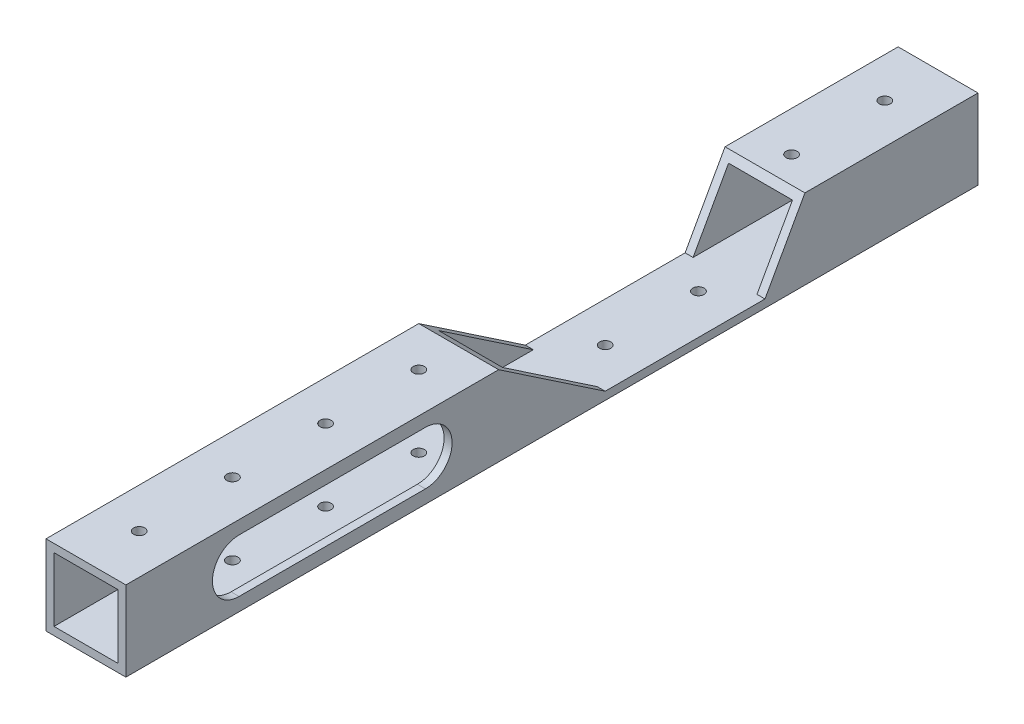
ISO-10303-21;
HEADER;
FILE_DESCRIPTION(('STEP AP214'),'2;1');
FILE_NAME('part.step','',(''),(''),'','','');
FILE_SCHEMA(('AUTOMOTIVE_DESIGN { 1 0 10303 214 1 1 1 1 }'));
ENDSEC;
DATA;
#1=APPLICATION_CONTEXT('core data for automotive mechanical design processes');
#2=APPLICATION_PROTOCOL_DEFINITION('international standard','automotive_design',2000,#1);
#3=PRODUCT_CONTEXT('',#1,'mechanical');
#4=PRODUCT('Part','Part','',(#3));
#5=PRODUCT_RELATED_PRODUCT_CATEGORY('part','',(#4));
#6=PRODUCT_DEFINITION_FORMATION('','',#4);
#7=PRODUCT_DEFINITION_CONTEXT('part definition',#1,'design');
#8=PRODUCT_DEFINITION('design','',#6,#7);
#9=PRODUCT_DEFINITION_SHAPE('','',#8);
#10=(LENGTH_UNIT() NAMED_UNIT(*) SI_UNIT(.MILLI.,.METRE.));
#11=(NAMED_UNIT(*) PLANE_ANGLE_UNIT() SI_UNIT($,.RADIAN.));
#12=(NAMED_UNIT(*) SI_UNIT($,.STERADIAN.) SOLID_ANGLE_UNIT());
#13=UNCERTAINTY_MEASURE_WITH_UNIT(LENGTH_MEASURE(1.E-05),#10,'distance_accuracy_value','');
#14=(GEOMETRIC_REPRESENTATION_CONTEXT(3) GLOBAL_UNCERTAINTY_ASSIGNED_CONTEXT((#13)) GLOBAL_UNIT_ASSIGNED_CONTEXT((#10,
#11,#12)) REPRESENTATION_CONTEXT('',''));
#15=CARTESIAN_POINT('',(0.,0.,0.));
#16=DIRECTION('',(0.,0.,1.));
#17=DIRECTION('',(1.,0.,0.));
#18=AXIS2_PLACEMENT_3D('',#15,#16,#17);
#19=CARTESIAN_POINT('',(0.,0.,320.));
#20=DIRECTION('',(1.,0.,0.));
#21=DIRECTION('',(0.,0.,-1.));
#22=AXIS2_PLACEMENT_3D('',#19,#20,#21);
#23=PLANE('',#22);
#24=DIRECTION('',(0.,0.,1.));
#25=VECTOR('',#24,1.);
#26=CARTESIAN_POINT('',(0.,25.,277.5));
#27=LINE('',#26,#25);
#28=CARTESIAN_POINT('',(0.,25.,207.5));
#29=VERTEX_POINT('',#28);
#30=CARTESIAN_POINT('',(0.,25.,277.5));
#31=VERTEX_POINT('',#30);
#32=EDGE_CURVE('E356',#29,#31,#27,.T.);
#33=ORIENTED_EDGE('',*,*,#32,.T.);
#34=CARTESIAN_POINT('',(0.,15.,277.5));
#35=DIRECTION('',(1.,0.,0.));
#36=DIRECTION('',(0.,0.,-1.));
#37=AXIS2_PLACEMENT_3D('',#34,#35,#36);
#38=CIRCLE('',#37,10.);
#39=CARTESIAN_POINT('',(0.,5.00000000000001,277.5));
#40=VERTEX_POINT('',#39);
#41=EDGE_CURVE('E346',#31,#40,#38,.T.);
#42=ORIENTED_EDGE('',*,*,#41,.T.);
#43=DIRECTION('',(0.,0.,-1.));
#44=VECTOR('',#43,1.);
#45=CARTESIAN_POINT('',(0.,5.00000000000001,277.5));
#46=LINE('',#45,#44);
#47=CARTESIAN_POINT('',(0.,5.00000000000001,207.5));
#48=VERTEX_POINT('',#47);
#49=EDGE_CURVE('E349',#40,#48,#46,.T.);
#50=ORIENTED_EDGE('',*,*,#49,.T.);
#51=CARTESIAN_POINT('',(0.,15.,207.5));
#52=DIRECTION('',(1.,0.,0.));
#53=DIRECTION('',(0.,0.,-1.));
#54=AXIS2_PLACEMENT_3D('',#51,#52,#53);
#55=CIRCLE('',#54,10.);
#56=EDGE_CURVE('E353',#48,#29,#55,.T.);
#57=ORIENTED_EDGE('',*,*,#56,.T.);
#58=EDGE_LOOP('',(#33,#42,#50,#57));
#59=FACE_BOUND('',#58,.T.);
#60=DIRECTION('',(0.,0.874157276121538,-0.485642931178632));
#61=VECTOR('',#60,1.);
#62=CARTESIAN_POINT('',(0.,34.6698113207547,62.4056603773585));
#63=LINE('',#62,#61);
#64=CARTESIAN_POINT('',(0.,3.00000000000001,80.));
#65=VERTEX_POINT('',#64);
#66=CARTESIAN_POINT('',(0.,30.,65.));
#67=VERTEX_POINT('',#66);
#68=EDGE_CURVE('E251',#65,#67,#63,.T.);
#69=ORIENTED_EDGE('',*,*,#68,.T.);
#70=DIRECTION('',(0.,0.,-1.));
#71=VECTOR('',#70,1.);
#72=CARTESIAN_POINT('',(0.,30.,320.));
#73=LINE('',#72,#71);
#74=CARTESIAN_POINT('',(0.,30.,0.));
#75=VERTEX_POINT('',#74);
#76=EDGE_CURVE('E439',#67,#75,#73,.T.);
#77=ORIENTED_EDGE('',*,*,#76,.T.);
#78=DIRECTION('',(0.,-1.,0.));
#79=VECTOR('',#78,1.);
#80=CARTESIAN_POINT('',(0.,0.,0.));
#81=LINE('',#80,#79);
#82=CARTESIAN_POINT('',(0.,0.,0.));
#83=VERTEX_POINT('',#82);
#84=EDGE_CURVE('E428',#75,#83,#81,.T.);
#85=ORIENTED_EDGE('',*,*,#84,.T.);
#86=DIRECTION('',(0.,0.,-1.));
#87=VECTOR('',#86,1.);
#88=CARTESIAN_POINT('',(0.,0.,320.));
#89=LINE('',#88,#87);
#90=CARTESIAN_POINT('',(0.,0.,320.));
#91=VERTEX_POINT('',#90);
#92=EDGE_CURVE('E457',#91,#83,#89,.T.);
#93=ORIENTED_EDGE('',*,*,#92,.F.);
#94=DIRECTION('',(0.,-1.,0.));
#95=VECTOR('',#94,1.);
#96=CARTESIAN_POINT('',(0.,0.,320.));
#97=LINE('',#96,#95);
#98=CARTESIAN_POINT('',(0.,30.,320.));
#99=VERTEX_POINT('',#98);
#100=EDGE_CURVE('E429',#99,#91,#97,.T.);
#101=ORIENTED_EDGE('',*,*,#100,.F.);
#102=CARTESIAN_POINT('',(0.,30.,180.));
#103=VERTEX_POINT('',#102);
#104=EDGE_CURVE('E448',#99,#103,#73,.T.);
#105=ORIENTED_EDGE('',*,*,#104,.T.);
#106=DIRECTION('',(0.,0.559472855001063,0.828848674075648));
#107=VECTOR('',#106,1.);
#108=CARTESIAN_POINT('',(0.,-62.8595963933019,42.4302275654788));
#109=LINE('',#108,#107);
#110=CARTESIAN_POINT('',(0.,3.,140.));
#111=VERTEX_POINT('',#110);
#112=EDGE_CURVE('E73',#111,#103,#109,.T.);
#113=ORIENTED_EDGE('',*,*,#112,.F.);
#114=DIRECTION('',(0.,0.,-1.));
#115=VECTOR('',#114,1.);
#116=CARTESIAN_POINT('',(0.,3.00000000000001,0.));
#117=LINE('',#116,#115);
#118=EDGE_CURVE('E248',#111,#65,#117,.T.);
#119=ORIENTED_EDGE('',*,*,#118,.T.);
#120=EDGE_LOOP('',(#69,#77,#85,#93,#101,#105,#113,#119));
#121=FACE_BOUND('',#120,.T.);
#122=ADVANCED_FACE('F59',(#59,#121),#23,.F.);
#123=CARTESIAN_POINT('',(30.,0.,320.));
#124=DIRECTION('',(-1.,0.,0.));
#125=DIRECTION('',(0.,0.,1.));
#126=AXIS2_PLACEMENT_3D('',#123,#124,#125);
#127=PLANE('',#126);
#128=DIRECTION('',(0.,0.,-1.));
#129=VECTOR('',#128,1.);
#130=CARTESIAN_POINT('',(30.,5.00000000000001,277.5));
#131=LINE('',#130,#129);
#132=CARTESIAN_POINT('',(30.,5.00000000000001,277.5));
#133=VERTEX_POINT('',#132);
#134=CARTESIAN_POINT('',(30.,4.99999999999999,207.5));
#135=VERTEX_POINT('',#134);
#136=EDGE_CURVE('E361',#133,#135,#131,.T.);
#137=ORIENTED_EDGE('',*,*,#136,.F.);
#138=CARTESIAN_POINT('',(30.,15.,277.5));
#139=DIRECTION('',(1.,0.,0.));
#140=DIRECTION('',(0.,0.,-1.));
#141=AXIS2_PLACEMENT_3D('',#138,#139,#140);
#142=CIRCLE('',#141,10.);
#143=CARTESIAN_POINT('',(30.,25.,277.5));
#144=VERTEX_POINT('',#143);
#145=EDGE_CURVE('E345',#144,#133,#142,.T.);
#146=ORIENTED_EDGE('',*,*,#145,.F.);
#147=DIRECTION('',(0.,0.,1.));
#148=VECTOR('',#147,1.);
#149=CARTESIAN_POINT('',(30.,25.,277.5));
#150=LINE('',#149,#148);
#151=CARTESIAN_POINT('',(30.,25.,207.5));
#152=VERTEX_POINT('',#151);
#153=EDGE_CURVE('E350',#152,#144,#150,.T.);
#154=ORIENTED_EDGE('',*,*,#153,.F.);
#155=CARTESIAN_POINT('',(30.,15.,207.5));
#156=DIRECTION('',(1.,0.,0.));
#157=DIRECTION('',(0.,0.,-1.));
#158=AXIS2_PLACEMENT_3D('',#155,#156,#157);
#159=CIRCLE('',#158,10.);
#160=EDGE_CURVE('E364',#135,#152,#159,.T.);
#161=ORIENTED_EDGE('',*,*,#160,.F.);
#162=EDGE_LOOP('',(#137,#146,#154,#161));
#163=FACE_BOUND('',#162,.T.);
#164=DIRECTION('',(0.,0.874157276121538,-0.485642931178632));
#165=VECTOR('',#164,1.);
#166=CARTESIAN_POINT('',(30.,34.6698113207547,62.4056603773585));
#167=LINE('',#166,#165);
#168=CARTESIAN_POINT('',(30.,3.00000000000001,80.));
#169=VERTEX_POINT('',#168);
#170=CARTESIAN_POINT('',(30.,30.,65.));
#171=VERTEX_POINT('',#170);
#172=EDGE_CURVE('E230',#169,#171,#167,.T.);
#173=ORIENTED_EDGE('',*,*,#172,.F.);
#174=DIRECTION('',(0.,0.,-1.));
#175=VECTOR('',#174,1.);
#176=CARTESIAN_POINT('',(30.,3.00000000000001,0.));
#177=LINE('',#176,#175);
#178=CARTESIAN_POINT('',(30.,3.,140.));
#179=VERTEX_POINT('',#178);
#180=EDGE_CURVE('E218',#179,#169,#177,.T.);
#181=ORIENTED_EDGE('',*,*,#180,.F.);
#182=DIRECTION('',(0.,0.559472855001063,0.828848674075648));
#183=VECTOR('',#182,1.);
#184=CARTESIAN_POINT('',(30.,-62.8595963933019,42.4302275654788));
#185=LINE('',#184,#183);
#186=CARTESIAN_POINT('',(30.,30.,180.));
#187=VERTEX_POINT('',#186);
#188=EDGE_CURVE('E243',#179,#187,#185,.T.);
#189=ORIENTED_EDGE('',*,*,#188,.T.);
#190=DIRECTION('',(0.,0.,-1.));
#191=VECTOR('',#190,1.);
#192=CARTESIAN_POINT('',(30.,30.,320.));
#193=LINE('',#192,#191);
#194=CARTESIAN_POINT('',(30.,30.,320.));
#195=VERTEX_POINT('',#194);
#196=EDGE_CURVE('E451',#195,#187,#193,.T.);
#197=ORIENTED_EDGE('',*,*,#196,.F.);
#198=DIRECTION('',(0.,1.,0.));
#199=VECTOR('',#198,1.);
#200=CARTESIAN_POINT('',(30.,0.,320.));
#201=LINE('',#200,#199);
#202=CARTESIAN_POINT('',(30.,0.,320.));
#203=VERTEX_POINT('',#202);
#204=EDGE_CURVE('E435',#203,#195,#201,.T.);
#205=ORIENTED_EDGE('',*,*,#204,.F.);
#206=DIRECTION('',(0.,0.,-1.));
#207=VECTOR('',#206,1.);
#208=CARTESIAN_POINT('',(30.,0.,320.));
#209=LINE('',#208,#207);
#210=CARTESIAN_POINT('',(30.,0.,0.));
#211=VERTEX_POINT('',#210);
#212=EDGE_CURVE('E454',#203,#211,#209,.T.);
#213=ORIENTED_EDGE('',*,*,#212,.T.);
#214=DIRECTION('',(0.,1.,0.));
#215=VECTOR('',#214,1.);
#216=CARTESIAN_POINT('',(30.,0.,0.));
#217=LINE('',#216,#215);
#218=CARTESIAN_POINT('',(30.,30.,0.));
#219=VERTEX_POINT('',#218);
#220=EDGE_CURVE('E444',#211,#219,#217,.T.);
#221=ORIENTED_EDGE('',*,*,#220,.T.);
#222=EDGE_CURVE('E242',#171,#219,#193,.T.);
#223=ORIENTED_EDGE('',*,*,#222,.F.);
#224=EDGE_LOOP('',(#173,#181,#189,#197,#205,#213,#221,#223));
#225=FACE_BOUND('',#224,.T.);
#226=ADVANCED_FACE('F240',(#163,#225),#127,.F.);
#227=CARTESIAN_POINT('',(0.,30.,320.));
#228=DIRECTION('',(0.,-1.,0.));
#229=DIRECTION('',(0.,0.,-1.));
#230=AXIS2_PLACEMENT_3D('',#227,#228,#229);
#231=PLANE('',#230);
#232=CARTESIAN_POINT('',(15.,30.,55.));
#233=DIRECTION('',(0.,1.,0.));
#234=DIRECTION('',(0.,0.,1.));
#235=AXIS2_PLACEMENT_3D('',#232,#233,#234);
#236=CIRCLE('',#235,2.1);
#237=CARTESIAN_POINT('',(15.,30.,57.1));
#238=VERTEX_POINT('',#237);
#239=EDGE_CURVE('E293',#238,#238,#236,.T.);
#240=ORIENTED_EDGE('',*,*,#239,.F.);
#241=EDGE_LOOP('',(#240));
#242=FACE_BOUND('',#241,.T.);
#243=CARTESIAN_POINT('',(15.,30.,20.));
#244=DIRECTION('',(0.,1.,0.));
#245=DIRECTION('',(0.,0.,1.));
#246=AXIS2_PLACEMENT_3D('',#243,#244,#245);
#247=CIRCLE('',#246,2.1);
#248=CARTESIAN_POINT('',(15.,30.,22.1));
#249=VERTEX_POINT('',#248);
#250=EDGE_CURVE('E335',#249,#249,#247,.T.);
#251=ORIENTED_EDGE('',*,*,#250,.F.);
#252=EDGE_LOOP('',(#251));
#253=FACE_BOUND('',#252,.T.);
#254=DIRECTION('',(-1.,0.,0.));
#255=VECTOR('',#254,1.);
#256=CARTESIAN_POINT('',(30.,30.,65.));
#257=LINE('',#256,#255);
#258=EDGE_CURVE('E258',#171,#67,#257,.T.);
#259=ORIENTED_EDGE('',*,*,#258,.F.);
#260=ORIENTED_EDGE('',*,*,#222,.T.);
#261=DIRECTION('',(-1.,0.,0.));
#262=VECTOR('',#261,1.);
#263=CARTESIAN_POINT('',(0.,30.,0.));
#264=LINE('',#263,#262);
#265=EDGE_CURVE('E433',#219,#75,#264,.T.);
#266=ORIENTED_EDGE('',*,*,#265,.T.);
#267=ORIENTED_EDGE('',*,*,#76,.F.);
#268=EDGE_LOOP('',(#259,#260,#266,#267));
#269=FACE_BOUND('',#268,.T.);
#270=ADVANCED_FACE('F522',(#242,#253,#269),#231,.F.);
#271=CARTESIAN_POINT('',(3.,0.,320.));
#272=DIRECTION('',(1.,0.,0.));
#273=DIRECTION('',(0.,0.,-1.));
#274=AXIS2_PLACEMENT_3D('',#271,#272,#273);
#275=PLANE('',#274);
#276=DIRECTION('',(0.,0.,-1.));
#277=VECTOR('',#276,1.);
#278=CARTESIAN_POINT('',(3.,27.,320.));
#279=LINE('',#278,#277);
#280=CARTESIAN_POINT('',(3.,27.,66.6666666666667));
#281=VERTEX_POINT('',#280);
#282=CARTESIAN_POINT('',(3.,27.,0.));
#283=VERTEX_POINT('',#282);
#284=EDGE_CURVE('E403',#281,#283,#279,.T.);
#285=ORIENTED_EDGE('',*,*,#284,.F.);
#286=DIRECTION('',(0.,-0.874157276121538,0.485642931178632));
#287=VECTOR('',#286,1.);
#288=CARTESIAN_POINT('',(3.,-101.179245283019,137.877358490566));
#289=LINE('',#288,#287);
#290=CARTESIAN_POINT('',(3.,3.00000000000001,80.));
#291=VERTEX_POINT('',#290);
#292=EDGE_CURVE('E264',#281,#291,#289,.T.);
#293=ORIENTED_EDGE('',*,*,#292,.T.);
#294=DIRECTION('',(0.,0.,-1.));
#295=VECTOR('',#294,1.);
#296=CARTESIAN_POINT('',(3.,3.,320.));
#297=LINE('',#296,#295);
#298=CARTESIAN_POINT('',(3.,3.,0.));
#299=VERTEX_POINT('',#298);
#300=EDGE_CURVE('E424',#291,#299,#297,.T.);
#301=ORIENTED_EDGE('',*,*,#300,.T.);
#302=DIRECTION('',(0.,-1.,0.));
#303=VECTOR('',#302,1.);
#304=CARTESIAN_POINT('',(3.,0.,0.));
#305=LINE('',#304,#303);
#306=EDGE_CURVE('E392',#283,#299,#305,.T.);
#307=ORIENTED_EDGE('',*,*,#306,.F.);
#308=EDGE_LOOP('',(#285,#293,#301,#307));
#309=FACE_BOUND('',#308,.T.);
#310=ADVANCED_FACE('F525',(#309),#275,.T.);
#311=CARTESIAN_POINT('',(27.,0.,320.));
#312=DIRECTION('',(-1.,0.,0.));
#313=DIRECTION('',(0.,0.,1.));
#314=AXIS2_PLACEMENT_3D('',#311,#312,#313);
#315=PLANE('',#314);
#316=DIRECTION('',(0.,0.,-1.));
#317=VECTOR('',#316,1.);
#318=CARTESIAN_POINT('',(27.,3.,320.));
#319=LINE('',#318,#317);
#320=CARTESIAN_POINT('',(27.,3.00000000000001,80.));
#321=VERTEX_POINT('',#320);
#322=CARTESIAN_POINT('',(27.,3.,0.));
#323=VERTEX_POINT('',#322);
#324=EDGE_CURVE('E421',#321,#323,#319,.T.);
#325=ORIENTED_EDGE('',*,*,#324,.F.);
#326=DIRECTION('',(0.,0.874157276121538,-0.485642931178632));
#327=VECTOR('',#326,1.);
#328=CARTESIAN_POINT('',(27.,-101.179245283019,137.877358490566));
#329=LINE('',#328,#327);
#330=CARTESIAN_POINT('',(27.,27.,66.6666666666667));
#331=VERTEX_POINT('',#330);
#332=EDGE_CURVE('E236',#321,#331,#329,.T.);
#333=ORIENTED_EDGE('',*,*,#332,.T.);
#334=DIRECTION('',(0.,0.,-1.));
#335=VECTOR('',#334,1.);
#336=CARTESIAN_POINT('',(27.,27.,320.));
#337=LINE('',#336,#335);
#338=CARTESIAN_POINT('',(27.,27.,0.));
#339=VERTEX_POINT('',#338);
#340=EDGE_CURVE('E417',#331,#339,#337,.T.);
#341=ORIENTED_EDGE('',*,*,#340,.T.);
#342=DIRECTION('',(0.,1.,0.));
#343=VECTOR('',#342,1.);
#344=CARTESIAN_POINT('',(27.,0.,0.));
#345=LINE('',#344,#343);
#346=EDGE_CURVE('E409',#323,#339,#345,.T.);
#347=ORIENTED_EDGE('',*,*,#346,.F.);
#348=EDGE_LOOP('',(#325,#333,#341,#347));
#349=FACE_BOUND('',#348,.T.);
#350=ADVANCED_FACE('F534',(#349),#315,.T.);
#351=CARTESIAN_POINT('',(0.,27.,320.));
#352=DIRECTION('',(0.,-1.,0.));
#353=DIRECTION('',(0.,0.,-1.));
#354=AXIS2_PLACEMENT_3D('',#351,#352,#353);
#355=PLANE('',#354);
#356=CARTESIAN_POINT('',(15.,27.,55.));
#357=DIRECTION('',(0.,-1.,0.));
#358=DIRECTION('',(0.,0.,-1.));
#359=AXIS2_PLACEMENT_3D('',#356,#357,#358);
#360=CIRCLE('',#359,2.1);
#361=CARTESIAN_POINT('',(15.,27.,52.9));
#362=VERTEX_POINT('',#361);
#363=EDGE_CURVE('E292',#362,#362,#360,.T.);
#364=ORIENTED_EDGE('',*,*,#363,.F.);
#365=EDGE_LOOP('',(#364));
#366=FACE_BOUND('',#365,.T.);
#367=CARTESIAN_POINT('',(15.,27.,20.));
#368=DIRECTION('',(0.,-1.,0.));
#369=DIRECTION('',(0.,0.,-1.));
#370=AXIS2_PLACEMENT_3D('',#367,#368,#369);
#371=CIRCLE('',#370,2.1);
#372=CARTESIAN_POINT('',(15.,27.,17.9));
#373=VERTEX_POINT('',#372);
#374=EDGE_CURVE('E339',#373,#373,#371,.T.);
#375=ORIENTED_EDGE('',*,*,#374,.F.);
#376=EDGE_LOOP('',(#375));
#377=FACE_BOUND('',#376,.T.);
#378=ORIENTED_EDGE('',*,*,#340,.F.);
#379=DIRECTION('',(-1.,0.,0.));
#380=VECTOR('',#379,1.);
#381=CARTESIAN_POINT('',(0.,27.,66.6666666666667));
#382=LINE('',#381,#380);
#383=EDGE_CURVE('E12',#331,#281,#382,.T.);
#384=ORIENTED_EDGE('',*,*,#383,.T.);
#385=ORIENTED_EDGE('',*,*,#284,.T.);
#386=DIRECTION('',(-1.,0.,0.));
#387=VECTOR('',#386,1.);
#388=CARTESIAN_POINT('',(0.,27.,0.));
#389=LINE('',#388,#387);
#390=EDGE_CURVE('E396',#339,#283,#389,.T.);
#391=ORIENTED_EDGE('',*,*,#390,.F.);
#392=EDGE_LOOP('',(#378,#384,#385,#391));
#393=FACE_BOUND('',#392,.T.);
#394=ADVANCED_FACE('F532',(#366,#377,#393),#355,.T.);
#395=CARTESIAN_POINT('',(0.,0.,320.));
#396=DIRECTION('',(0.,0.,1.));
#397=DIRECTION('',(1.,0.,0.));
#398=AXIS2_PLACEMENT_3D('',#395,#396,#397);
#399=PLANE('',#398);
#400=ORIENTED_EDGE('',*,*,#100,.T.);
#401=DIRECTION('',(1.,0.,0.));
#402=VECTOR('',#401,1.);
#403=CARTESIAN_POINT('',(0.,0.,320.));
#404=LINE('',#403,#402);
#405=EDGE_CURVE('E432',#91,#203,#404,.T.);
#406=ORIENTED_EDGE('',*,*,#405,.T.);
#407=ORIENTED_EDGE('',*,*,#204,.T.);
#408=DIRECTION('',(-1.,0.,0.));
#409=VECTOR('',#408,1.);
#410=CARTESIAN_POINT('',(0.,30.,320.));
#411=LINE('',#410,#409);
#412=EDGE_CURVE('E437',#195,#99,#411,.T.);
#413=ORIENTED_EDGE('',*,*,#412,.T.);
#414=EDGE_LOOP('',(#400,#406,#407,#413));
#415=FACE_BOUND('',#414,.T.);
#416=DIRECTION('',(1.,0.,0.));
#417=VECTOR('',#416,1.);
#418=CARTESIAN_POINT('',(0.,3.,320.));
#419=LINE('',#418,#417);
#420=CARTESIAN_POINT('',(3.,3.,320.));
#421=VERTEX_POINT('',#420);
#422=CARTESIAN_POINT('',(27.,3.,320.));
#423=VERTEX_POINT('',#422);
#424=EDGE_CURVE('E395',#421,#423,#419,.T.);
#425=ORIENTED_EDGE('',*,*,#424,.F.);
#426=DIRECTION('',(0.,-1.,0.));
#427=VECTOR('',#426,1.);
#428=CARTESIAN_POINT('',(3.,0.,320.));
#429=LINE('',#428,#427);
#430=CARTESIAN_POINT('',(3.,27.,320.));
#431=VERTEX_POINT('',#430);
#432=EDGE_CURVE('E393',#431,#421,#429,.T.);
#433=ORIENTED_EDGE('',*,*,#432,.F.);
#434=DIRECTION('',(-1.,0.,0.));
#435=VECTOR('',#434,1.);
#436=CARTESIAN_POINT('',(0.,27.,320.));
#437=LINE('',#436,#435);
#438=CARTESIAN_POINT('',(27.,27.,320.));
#439=VERTEX_POINT('',#438);
#440=EDGE_CURVE('E401',#439,#431,#437,.T.);
#441=ORIENTED_EDGE('',*,*,#440,.F.);
#442=DIRECTION('',(0.,1.,0.));
#443=VECTOR('',#442,1.);
#444=CARTESIAN_POINT('',(27.,0.,320.));
#445=LINE('',#444,#443);
#446=EDGE_CURVE('E398',#423,#439,#445,.T.);
#447=ORIENTED_EDGE('',*,*,#446,.F.);
#448=EDGE_LOOP('',(#425,#433,#441,#447));
#449=FACE_BOUND('',#448,.T.);
#450=ADVANCED_FACE('F496',(#415,#449),#399,.T.);
#451=CARTESIAN_POINT('',(0.,0.,0.));
#452=DIRECTION('',(0.,0.,1.));
#453=DIRECTION('',(1.,0.,0.));
#454=AXIS2_PLACEMENT_3D('',#451,#452,#453);
#455=PLANE('',#454);
#456=ORIENTED_EDGE('',*,*,#84,.F.);
#457=ORIENTED_EDGE('',*,*,#265,.F.);
#458=ORIENTED_EDGE('',*,*,#220,.F.);
#459=DIRECTION('',(1.,0.,0.));
#460=VECTOR('',#459,1.);
#461=CARTESIAN_POINT('',(0.,0.,0.));
#462=LINE('',#461,#460);
#463=EDGE_CURVE('E442',#83,#211,#462,.T.);
#464=ORIENTED_EDGE('',*,*,#463,.F.);
#465=EDGE_LOOP('',(#456,#457,#458,#464));
#466=FACE_BOUND('',#465,.T.);
#467=ORIENTED_EDGE('',*,*,#306,.T.);
#468=DIRECTION('',(1.,0.,0.));
#469=VECTOR('',#468,1.);
#470=CARTESIAN_POINT('',(0.,3.,0.));
#471=LINE('',#470,#469);
#472=EDGE_CURVE('E406',#299,#323,#471,.T.);
#473=ORIENTED_EDGE('',*,*,#472,.T.);
#474=ORIENTED_EDGE('',*,*,#346,.T.);
#475=ORIENTED_EDGE('',*,*,#390,.T.);
#476=EDGE_LOOP('',(#467,#473,#474,#475));
#477=FACE_BOUND('',#476,.T.);
#478=ADVANCED_FACE('F517',(#466,#477),#455,.F.);
#479=CARTESIAN_POINT('',(0.,0.,320.));
#480=DIRECTION('',(0.,1.,0.));
#481=DIRECTION('',(0.,0.,1.));
#482=AXIS2_PLACEMENT_3D('',#479,#480,#481);
#483=PLANE('',#482);
#484=CARTESIAN_POINT('',(15.,0.,160.));
#485=DIRECTION('',(0.,1.,0.));
#486=DIRECTION('',(0.,0.,1.));
#487=AXIS2_PLACEMENT_3D('',#484,#485,#486);
#488=CIRCLE('',#487,2.09999999999999);
#489=CARTESIAN_POINT('',(15.,0.,162.1));
#490=VERTEX_POINT('',#489);
#491=EDGE_CURVE('E267',#490,#490,#488,.T.);
#492=ORIENTED_EDGE('',*,*,#491,.T.);
#493=EDGE_LOOP('',(#492));
#494=FACE_BOUND('',#493,.T.);
#495=CARTESIAN_POINT('',(15.,0.,195.));
#496=DIRECTION('',(0.,1.,0.));
#497=DIRECTION('',(0.,0.,-1.));
#498=AXIS2_PLACEMENT_3D('',#495,#496,#497);
#499=CIRCLE('',#498,2.09999999999999);
#500=CARTESIAN_POINT('',(15.,0.,192.9));
#501=VERTEX_POINT('',#500);
#502=EDGE_CURVE('E281',#501,#501,#499,.T.);
#503=ORIENTED_EDGE('',*,*,#502,.T.);
#504=EDGE_LOOP('',(#503));
#505=FACE_BOUND('',#504,.T.);
#506=CARTESIAN_POINT('',(15.,0.,230.));
#507=DIRECTION('',(0.,1.,0.));
#508=DIRECTION('',(0.,0.,-1.));
#509=AXIS2_PLACEMENT_3D('',#506,#507,#508);
#510=CIRCLE('',#509,2.1);
#511=CARTESIAN_POINT('',(15.,0.,227.9));
#512=VERTEX_POINT('',#511);
#513=EDGE_CURVE('E275',#512,#512,#510,.T.);
#514=ORIENTED_EDGE('',*,*,#513,.T.);
#515=EDGE_LOOP('',(#514));
#516=FACE_BOUND('',#515,.T.);
#517=CARTESIAN_POINT('',(15.,0.,265.));
#518=DIRECTION('',(0.,1.,0.));
#519=DIRECTION('',(0.,0.,-1.));
#520=AXIS2_PLACEMENT_3D('',#517,#518,#519);
#521=CIRCLE('',#520,2.09999999999999);
#522=CARTESIAN_POINT('',(15.,0.,262.9));
#523=VERTEX_POINT('',#522);
#524=EDGE_CURVE('E268',#523,#523,#521,.T.);
#525=ORIENTED_EDGE('',*,*,#524,.T.);
#526=EDGE_LOOP('',(#525));
#527=FACE_BOUND('',#526,.T.);
#528=CARTESIAN_POINT('',(15.,0.,300.));
#529=DIRECTION('',(0.,1.,0.));
#530=DIRECTION('',(0.,0.,-1.));
#531=AXIS2_PLACEMENT_3D('',#528,#529,#530);
#532=CIRCLE('',#531,2.09999999999999);
#533=CARTESIAN_POINT('',(15.,0.,297.9));
#534=VERTEX_POINT('',#533);
#535=EDGE_CURVE('E302',#534,#534,#532,.T.);
#536=ORIENTED_EDGE('',*,*,#535,.T.);
#537=EDGE_LOOP('',(#536));
#538=FACE_BOUND('',#537,.T.);
#539=CARTESIAN_POINT('',(15.,0.,125.));
#540=DIRECTION('',(0.,1.,0.));
#541=DIRECTION('',(0.,0.,1.));
#542=AXIS2_PLACEMENT_3D('',#539,#540,#541);
#543=CIRCLE('',#542,2.1);
#544=CARTESIAN_POINT('',(15.,0.,127.1));
#545=VERTEX_POINT('',#544);
#546=EDGE_CURVE('E299',#545,#545,#543,.T.);
#547=ORIENTED_EDGE('',*,*,#546,.T.);
#548=EDGE_LOOP('',(#547));
#549=FACE_BOUND('',#548,.T.);
#550=CARTESIAN_POINT('',(15.,0.,90.));
#551=DIRECTION('',(0.,1.,0.));
#552=DIRECTION('',(0.,0.,1.));
#553=AXIS2_PLACEMENT_3D('',#550,#551,#552);
#554=CIRCLE('',#553,2.1);
#555=CARTESIAN_POINT('',(15.,0.,92.1));
#556=VERTEX_POINT('',#555);
#557=EDGE_CURVE('E296',#556,#556,#554,.T.);
#558=ORIENTED_EDGE('',*,*,#557,.T.);
#559=EDGE_LOOP('',(#558));
#560=FACE_BOUND('',#559,.T.);
#561=CARTESIAN_POINT('',(15.,0.,55.));
#562=DIRECTION('',(0.,1.,0.));
#563=DIRECTION('',(0.,0.,1.));
#564=AXIS2_PLACEMENT_3D('',#561,#562,#563);
#565=CIRCLE('',#564,2.1);
#566=CARTESIAN_POINT('',(15.,0.,57.1));
#567=VERTEX_POINT('',#566);
#568=EDGE_CURVE('E289',#567,#567,#565,.T.);
#569=ORIENTED_EDGE('',*,*,#568,.T.);
#570=EDGE_LOOP('',(#569));
#571=FACE_BOUND('',#570,.T.);
#572=CARTESIAN_POINT('',(15.,0.,20.));
#573=DIRECTION('',(0.,1.,0.));
#574=DIRECTION('',(0.,0.,1.));
#575=AXIS2_PLACEMENT_3D('',#572,#573,#574);
#576=CIRCLE('',#575,2.1);
#577=CARTESIAN_POINT('',(15.,0.,22.1));
#578=VERTEX_POINT('',#577);
#579=EDGE_CURVE('E336',#578,#578,#576,.T.);
#580=ORIENTED_EDGE('',*,*,#579,.T.);
#581=EDGE_LOOP('',(#580));
#582=FACE_BOUND('',#581,.T.);
#583=ORIENTED_EDGE('',*,*,#463,.T.);
#584=ORIENTED_EDGE('',*,*,#212,.F.);
#585=ORIENTED_EDGE('',*,*,#405,.F.);
#586=ORIENTED_EDGE('',*,*,#92,.T.);
#587=EDGE_LOOP('',(#583,#584,#585,#586));
#588=FACE_BOUND('',#587,.T.);
#589=ADVANCED_FACE('F514',(#494,#505,#516,#527,#538,#549,#560,#571,#582,#588),#483,.F.);
#590=CARTESIAN_POINT('',(15.,30.,195.));
#591=DIRECTION('',(0.,1.,0.));
#592=DIRECTION('',(0.,0.,-1.));
#593=AXIS2_PLACEMENT_3D('',#590,#591,#592);
#594=CIRCLE('',#593,2.09999999999999);
#595=CARTESIAN_POINT('',(15.,30.,192.9));
#596=VERTEX_POINT('',#595);
#597=EDGE_CURVE('E284',#596,#596,#594,.T.);
#598=ORIENTED_EDGE('',*,*,#597,.F.);
#599=EDGE_LOOP('',(#598));
#600=FACE_BOUND('',#599,.T.);
#601=CARTESIAN_POINT('',(15.,30.,230.));
#602=DIRECTION('',(0.,1.,0.));
#603=DIRECTION('',(0.,0.,-1.));
#604=AXIS2_PLACEMENT_3D('',#601,#602,#603);
#605=CIRCLE('',#604,2.1);
#606=CARTESIAN_POINT('',(15.,30.,227.9));
#607=VERTEX_POINT('',#606);
#608=EDGE_CURVE('E278',#607,#607,#605,.T.);
#609=ORIENTED_EDGE('',*,*,#608,.F.);
#610=EDGE_LOOP('',(#609));
#611=FACE_BOUND('',#610,.T.);
#612=CARTESIAN_POINT('',(15.,30.,265.));
#613=DIRECTION('',(0.,1.,0.));
#614=DIRECTION('',(0.,0.,-1.));
#615=AXIS2_PLACEMENT_3D('',#612,#613,#614);
#616=CIRCLE('',#615,2.09999999999999);
#617=CARTESIAN_POINT('',(15.,30.,262.9));
#618=VERTEX_POINT('',#617);
#619=EDGE_CURVE('E272',#618,#618,#616,.T.);
#620=ORIENTED_EDGE('',*,*,#619,.F.);
#621=EDGE_LOOP('',(#620));
#622=FACE_BOUND('',#621,.T.);
#623=CARTESIAN_POINT('',(15.,30.,300.));
#624=DIRECTION('',(0.,1.,0.));
#625=DIRECTION('',(0.,0.,-1.));
#626=AXIS2_PLACEMENT_3D('',#623,#624,#625);
#627=CIRCLE('',#626,2.09999999999999);
#628=CARTESIAN_POINT('',(15.,30.,297.9));
#629=VERTEX_POINT('',#628);
#630=EDGE_CURVE('E271',#629,#629,#627,.T.);
#631=ORIENTED_EDGE('',*,*,#630,.F.);
#632=EDGE_LOOP('',(#631));
#633=FACE_BOUND('',#632,.T.);
#634=ORIENTED_EDGE('',*,*,#196,.T.);
#635=DIRECTION('',(-1.,0.,0.));
#636=VECTOR('',#635,1.);
#637=CARTESIAN_POINT('',(30.,30.,180.));
#638=LINE('',#637,#636);
#639=EDGE_CURVE('E256',#187,#103,#638,.T.);
#640=ORIENTED_EDGE('',*,*,#639,.T.);
#641=ORIENTED_EDGE('',*,*,#104,.F.);
#642=ORIENTED_EDGE('',*,*,#412,.F.);
#643=EDGE_LOOP('',(#634,#640,#641,#642));
#644=FACE_BOUND('',#643,.T.);
#645=ADVANCED_FACE('F507',(#600,#611,#622,#633,#644),#231,.F.);
#646=DIRECTION('',(0.,-0.559472855001063,-0.828848674075648));
#647=VECTOR('',#646,1.);
#648=CARTESIAN_POINT('',(3.,85.5302705023615,262.267067410906));
#649=LINE('',#648,#647);
#650=CARTESIAN_POINT('',(3.,27.,175.555555555556));
#651=VERTEX_POINT('',#650);
#652=CARTESIAN_POINT('',(3.,3.,140.));
#653=VERTEX_POINT('',#652);
#654=EDGE_CURVE('E261',#651,#653,#649,.T.);
#655=ORIENTED_EDGE('',*,*,#654,.F.);
#656=EDGE_CURVE('E414',#431,#651,#279,.T.);
#657=ORIENTED_EDGE('',*,*,#656,.F.);
#658=ORIENTED_EDGE('',*,*,#432,.T.);
#659=EDGE_CURVE('E425',#421,#653,#297,.T.);
#660=ORIENTED_EDGE('',*,*,#659,.T.);
#661=EDGE_LOOP('',(#655,#657,#658,#660));
#662=FACE_BOUND('',#661,.T.);
#663=CARTESIAN_POINT('',(3.,15.,277.5));
#664=DIRECTION('',(1.,0.,0.));
#665=DIRECTION('',(0.,0.,-1.));
#666=AXIS2_PLACEMENT_3D('',#663,#664,#665);
#667=CIRCLE('',#666,10.);
#668=CARTESIAN_POINT('',(3.,25.,277.5));
#669=VERTEX_POINT('',#668);
#670=CARTESIAN_POINT('',(3.,5.00000000000001,277.5));
#671=VERTEX_POINT('',#670);
#672=EDGE_CURVE('E389',#669,#671,#667,.T.);
#673=ORIENTED_EDGE('',*,*,#672,.F.);
#674=DIRECTION('',(0.,0.,1.));
#675=VECTOR('',#674,1.);
#676=CARTESIAN_POINT('',(3.,25.,320.));
#677=LINE('',#676,#675);
#678=CARTESIAN_POINT('',(3.,25.,207.5));
#679=VERTEX_POINT('',#678);
#680=EDGE_CURVE('E387',#679,#669,#677,.T.);
#681=ORIENTED_EDGE('',*,*,#680,.F.);
#682=CARTESIAN_POINT('',(3.,15.,207.5));
#683=DIRECTION('',(1.,0.,0.));
#684=DIRECTION('',(0.,0.,-1.));
#685=AXIS2_PLACEMENT_3D('',#682,#683,#684);
#686=CIRCLE('',#685,10.);
#687=CARTESIAN_POINT('',(3.,4.99999999999999,207.5));
#688=VERTEX_POINT('',#687);
#689=EDGE_CURVE('E385',#688,#679,#686,.T.);
#690=ORIENTED_EDGE('',*,*,#689,.F.);
#691=DIRECTION('',(0.,0.,-1.));
#692=VECTOR('',#691,1.);
#693=CARTESIAN_POINT('',(3.,5.00000000000001,320.));
#694=LINE('',#693,#692);
#695=EDGE_CURVE('E372',#671,#688,#694,.T.);
#696=ORIENTED_EDGE('',*,*,#695,.F.);
#697=EDGE_LOOP('',(#673,#681,#690,#696));
#698=FACE_BOUND('',#697,.T.);
#699=ADVANCED_FACE('F486',(#662,#698),#275,.T.);
#700=CARTESIAN_POINT('',(0.,3.,320.));
#701=DIRECTION('',(0.,1.,0.));
#702=DIRECTION('',(0.,0.,1.));
#703=AXIS2_PLACEMENT_3D('',#700,#701,#702);
#704=PLANE('',#703);
#705=CARTESIAN_POINT('',(27.,3.,140.));
#706=VERTEX_POINT('',#705);
#707=EDGE_CURVE('E422',#423,#706,#319,.T.);
#708=ORIENTED_EDGE('',*,*,#707,.T.);
#709=DIRECTION('',(-1.,0.,0.));
#710=VECTOR('',#709,1.);
#711=CARTESIAN_POINT('',(30.,3.,140.));
#712=LINE('',#711,#710);
#713=EDGE_CURVE('E225',#179,#706,#712,.T.);
#714=ORIENTED_EDGE('',*,*,#713,.F.);
#715=ORIENTED_EDGE('',*,*,#180,.T.);
#716=DIRECTION('',(-1.,0.,0.));
#717=VECTOR('',#716,1.);
#718=CARTESIAN_POINT('',(30.,3.00000000000001,80.));
#719=LINE('',#718,#717);
#720=EDGE_CURVE('E223',#169,#321,#719,.T.);
#721=ORIENTED_EDGE('',*,*,#720,.T.);
#722=ORIENTED_EDGE('',*,*,#324,.T.);
#723=ORIENTED_EDGE('',*,*,#472,.F.);
#724=ORIENTED_EDGE('',*,*,#300,.F.);
#725=EDGE_CURVE('E237',#291,#65,#719,.T.);
#726=ORIENTED_EDGE('',*,*,#725,.T.);
#727=ORIENTED_EDGE('',*,*,#118,.F.);
#728=EDGE_CURVE('E245',#653,#111,#712,.T.);
#729=ORIENTED_EDGE('',*,*,#728,.F.);
#730=ORIENTED_EDGE('',*,*,#659,.F.);
#731=ORIENTED_EDGE('',*,*,#424,.T.);
#732=EDGE_LOOP('',(#708,#714,#715,#721,#722,#723,#724,#726,#727,#729,#730,#731));
#733=FACE_BOUND('',#732,.T.);
#734=CARTESIAN_POINT('',(15.,3.,160.));
#735=DIRECTION('',(0.,1.,0.));
#736=DIRECTION('',(0.,0.,1.));
#737=AXIS2_PLACEMENT_3D('',#734,#735,#736);
#738=CIRCLE('',#737,2.09999999999999);
#739=CARTESIAN_POINT('',(15.,3.,162.1));
#740=VERTEX_POINT('',#739);
#741=EDGE_CURVE('E332',#740,#740,#738,.T.);
#742=ORIENTED_EDGE('',*,*,#741,.F.);
#743=EDGE_LOOP('',(#742));
#744=FACE_BOUND('',#743,.T.);
#745=CARTESIAN_POINT('',(15.,3.,195.));
#746=DIRECTION('',(0.,1.,0.));
#747=DIRECTION('',(0.,0.,1.));
#748=AXIS2_PLACEMENT_3D('',#745,#746,#747);
#749=CIRCLE('',#748,2.09999999999999);
#750=CARTESIAN_POINT('',(15.,3.,197.1));
#751=VERTEX_POINT('',#750);
#752=EDGE_CURVE('E329',#751,#751,#749,.T.);
#753=ORIENTED_EDGE('',*,*,#752,.F.);
#754=EDGE_LOOP('',(#753));
#755=FACE_BOUND('',#754,.T.);
#756=CARTESIAN_POINT('',(15.,3.,230.));
#757=DIRECTION('',(0.,1.,0.));
#758=DIRECTION('',(0.,0.,1.));
#759=AXIS2_PLACEMENT_3D('',#756,#757,#758);
#760=CIRCLE('',#759,2.1);
#761=CARTESIAN_POINT('',(15.,3.,232.1));
#762=VERTEX_POINT('',#761);
#763=EDGE_CURVE('E325',#762,#762,#760,.T.);
#764=ORIENTED_EDGE('',*,*,#763,.F.);
#765=EDGE_LOOP('',(#764));
#766=FACE_BOUND('',#765,.T.);
#767=CARTESIAN_POINT('',(15.,3.,265.));
#768=DIRECTION('',(0.,1.,0.));
#769=DIRECTION('',(0.,0.,1.));
#770=AXIS2_PLACEMENT_3D('',#767,#768,#769);
#771=CIRCLE('',#770,2.09999999999999);
#772=CARTESIAN_POINT('',(15.,3.,267.1));
#773=VERTEX_POINT('',#772);
#774=EDGE_CURVE('E321',#773,#773,#771,.T.);
#775=ORIENTED_EDGE('',*,*,#774,.F.);
#776=EDGE_LOOP('',(#775));
#777=FACE_BOUND('',#776,.T.);
#778=CARTESIAN_POINT('',(15.,3.,300.));
#779=DIRECTION('',(0.,1.,0.));
#780=DIRECTION('',(0.,0.,1.));
#781=AXIS2_PLACEMENT_3D('',#778,#779,#780);
#782=CIRCLE('',#781,2.09999999999999);
#783=CARTESIAN_POINT('',(15.,3.,302.1));
#784=VERTEX_POINT('',#783);
#785=EDGE_CURVE('E317',#784,#784,#782,.T.);
#786=ORIENTED_EDGE('',*,*,#785,.F.);
#787=EDGE_LOOP('',(#786));
#788=FACE_BOUND('',#787,.T.);
#789=CARTESIAN_POINT('',(15.,3.,90.));
#790=DIRECTION('',(0.,1.,0.));
#791=DIRECTION('',(0.,0.,1.));
#792=AXIS2_PLACEMENT_3D('',#789,#790,#791);
#793=CIRCLE('',#792,2.1);
#794=CARTESIAN_POINT('',(15.,3.,92.1));
#795=VERTEX_POINT('',#794);
#796=EDGE_CURVE('E310',#795,#795,#793,.T.);
#797=ORIENTED_EDGE('',*,*,#796,.F.);
#798=EDGE_LOOP('',(#797));
#799=FACE_BOUND('',#798,.T.);
#800=CARTESIAN_POINT('',(15.,3.,125.));
#801=DIRECTION('',(0.,1.,0.));
#802=DIRECTION('',(0.,0.,1.));
#803=AXIS2_PLACEMENT_3D('',#800,#801,#802);
#804=CIRCLE('',#803,2.1);
#805=CARTESIAN_POINT('',(15.,3.,127.1));
#806=VERTEX_POINT('',#805);
#807=EDGE_CURVE('E313',#806,#806,#804,.T.);
#808=ORIENTED_EDGE('',*,*,#807,.F.);
#809=EDGE_LOOP('',(#808));
#810=FACE_BOUND('',#809,.T.);
#811=CARTESIAN_POINT('',(15.,3.,55.));
#812=DIRECTION('',(0.,1.,0.));
#813=DIRECTION('',(0.,0.,1.));
#814=AXIS2_PLACEMENT_3D('',#811,#812,#813);
#815=CIRCLE('',#814,2.1);
#816=CARTESIAN_POINT('',(15.,3.,57.1));
#817=VERTEX_POINT('',#816);
#818=EDGE_CURVE('E307',#817,#817,#815,.T.);
#819=ORIENTED_EDGE('',*,*,#818,.F.);
#820=EDGE_LOOP('',(#819));
#821=FACE_BOUND('',#820,.T.);
#822=CARTESIAN_POINT('',(15.,3.,20.));
#823=DIRECTION('',(0.,1.,0.));
#824=DIRECTION('',(0.,0.,1.));
#825=AXIS2_PLACEMENT_3D('',#822,#823,#824);
#826=CIRCLE('',#825,2.1);
#827=CARTESIAN_POINT('',(15.,3.,22.1));
#828=VERTEX_POINT('',#827);
#829=EDGE_CURVE('E342',#828,#828,#826,.T.);
#830=ORIENTED_EDGE('',*,*,#829,.F.);
#831=EDGE_LOOP('',(#830));
#832=FACE_BOUND('',#831,.T.);
#833=ADVANCED_FACE('F221',(#733,#744,#755,#766,#777,#788,#799,#810,#821,#832),#704,.T.);
#834=DIRECTION('',(0.,0.559472855001063,0.828848674075648));
#835=VECTOR('',#834,1.);
#836=CARTESIAN_POINT('',(27.,85.5302705023615,262.267067410906));
#837=LINE('',#836,#835);
#838=CARTESIAN_POINT('',(27.,27.,175.555555555556));
#839=VERTEX_POINT('',#838);
#840=EDGE_CURVE('E80',#706,#839,#837,.T.);
#841=ORIENTED_EDGE('',*,*,#840,.F.);
#842=ORIENTED_EDGE('',*,*,#707,.F.);
#843=ORIENTED_EDGE('',*,*,#446,.T.);
#844=EDGE_CURVE('E418',#439,#839,#337,.T.);
#845=ORIENTED_EDGE('',*,*,#844,.T.);
#846=EDGE_LOOP('',(#841,#842,#843,#845));
#847=FACE_BOUND('',#846,.T.);
#848=CARTESIAN_POINT('',(27.,15.,277.5));
#849=DIRECTION('',(-1.,0.,0.));
#850=DIRECTION('',(0.,0.,1.));
#851=AXIS2_PLACEMENT_3D('',#848,#849,#850);
#852=CIRCLE('',#851,10.);
#853=CARTESIAN_POINT('',(27.,5.00000000000001,277.5));
#854=VERTEX_POINT('',#853);
#855=CARTESIAN_POINT('',(27.,25.,277.5));
#856=VERTEX_POINT('',#855);
#857=EDGE_CURVE('E467',#854,#856,#852,.T.);
#858=ORIENTED_EDGE('',*,*,#857,.F.);
#859=DIRECTION('',(0.,0.,1.));
#860=VECTOR('',#859,1.);
#861=CARTESIAN_POINT('',(27.,5.00000000000001,320.));
#862=LINE('',#861,#860);
#863=CARTESIAN_POINT('',(27.,5.00000000000001,207.5));
#864=VERTEX_POINT('',#863);
#865=EDGE_CURVE('E460',#864,#854,#862,.T.);
#866=ORIENTED_EDGE('',*,*,#865,.F.);
#867=CARTESIAN_POINT('',(27.,15.,207.5));
#868=DIRECTION('',(-1.,0.,0.));
#869=DIRECTION('',(0.,0.,1.));
#870=AXIS2_PLACEMENT_3D('',#867,#868,#869);
#871=CIRCLE('',#870,10.);
#872=CARTESIAN_POINT('',(27.,25.,207.5));
#873=VERTEX_POINT('',#872);
#874=EDGE_CURVE('E462',#873,#864,#871,.T.);
#875=ORIENTED_EDGE('',*,*,#874,.F.);
#876=DIRECTION('',(0.,0.,-1.));
#877=VECTOR('',#876,1.);
#878=CARTESIAN_POINT('',(27.,25.,320.));
#879=LINE('',#878,#877);
#880=EDGE_CURVE('E465',#856,#873,#879,.T.);
#881=ORIENTED_EDGE('',*,*,#880,.F.);
#882=EDGE_LOOP('',(#858,#866,#875,#881));
#883=FACE_BOUND('',#882,.T.);
#884=ADVANCED_FACE('F537',(#847,#883),#315,.T.);
#885=DIRECTION('',(-1.,0.,0.));
#886=VECTOR('',#885,1.);
#887=CARTESIAN_POINT('',(0.,27.,175.555555555556));
#888=LINE('',#887,#886);
#889=EDGE_CURVE('E66',#839,#651,#888,.T.);
#890=ORIENTED_EDGE('',*,*,#889,.F.);
#891=ORIENTED_EDGE('',*,*,#844,.F.);
#892=ORIENTED_EDGE('',*,*,#440,.T.);
#893=ORIENTED_EDGE('',*,*,#656,.T.);
#894=EDGE_LOOP('',(#890,#891,#892,#893));
#895=FACE_BOUND('',#894,.T.);
#896=CARTESIAN_POINT('',(15.,27.,195.));
#897=DIRECTION('',(0.,-1.,0.));
#898=DIRECTION('',(0.,0.,-1.));
#899=AXIS2_PLACEMENT_3D('',#896,#897,#898);
#900=CIRCLE('',#899,2.09999999999999);
#901=CARTESIAN_POINT('',(15.,27.,192.9));
#902=VERTEX_POINT('',#901);
#903=EDGE_CURVE('E328',#902,#902,#900,.T.);
#904=ORIENTED_EDGE('',*,*,#903,.F.);
#905=EDGE_LOOP('',(#904));
#906=FACE_BOUND('',#905,.T.);
#907=CARTESIAN_POINT('',(15.,27.,230.));
#908=DIRECTION('',(0.,-1.,0.));
#909=DIRECTION('',(0.,0.,-1.));
#910=AXIS2_PLACEMENT_3D('',#907,#908,#909);
#911=CIRCLE('',#910,2.1);
#912=CARTESIAN_POINT('',(15.,27.,227.9));
#913=VERTEX_POINT('',#912);
#914=EDGE_CURVE('E324',#913,#913,#911,.T.);
#915=ORIENTED_EDGE('',*,*,#914,.F.);
#916=EDGE_LOOP('',(#915));
#917=FACE_BOUND('',#916,.T.);
#918=CARTESIAN_POINT('',(15.,27.,265.));
#919=DIRECTION('',(0.,-1.,0.));
#920=DIRECTION('',(0.,0.,-1.));
#921=AXIS2_PLACEMENT_3D('',#918,#919,#920);
#922=CIRCLE('',#921,2.09999999999999);
#923=CARTESIAN_POINT('',(15.,27.,262.9));
#924=VERTEX_POINT('',#923);
#925=EDGE_CURVE('E320',#924,#924,#922,.T.);
#926=ORIENTED_EDGE('',*,*,#925,.F.);
#927=EDGE_LOOP('',(#926));
#928=FACE_BOUND('',#927,.T.);
#929=CARTESIAN_POINT('',(15.,27.,300.));
#930=DIRECTION('',(0.,-1.,0.));
#931=DIRECTION('',(0.,0.,-1.));
#932=AXIS2_PLACEMENT_3D('',#929,#930,#931);
#933=CIRCLE('',#932,2.09999999999999);
#934=CARTESIAN_POINT('',(15.,27.,297.9));
#935=VERTEX_POINT('',#934);
#936=EDGE_CURVE('E316',#935,#935,#933,.T.);
#937=ORIENTED_EDGE('',*,*,#936,.F.);
#938=EDGE_LOOP('',(#937));
#939=FACE_BOUND('',#938,.T.);
#940=ADVANCED_FACE('F490',(#895,#906,#917,#928,#939),#355,.T.);
#941=CARTESIAN_POINT('',(0.,5.00000000000001,277.5));
#942=DIRECTION('',(0.,-1.,0.));
#943=DIRECTION('',(0.,0.,-1.));
#944=AXIS2_PLACEMENT_3D('',#941,#942,#943);
#945=PLANE('',#944);
#946=ORIENTED_EDGE('',*,*,#865,.T.);
#947=DIRECTION('',(1.,0.,0.));
#948=VECTOR('',#947,1.);
#949=CARTESIAN_POINT('',(0.,5.00000000000001,277.5));
#950=LINE('',#949,#948);
#951=EDGE_CURVE('E359',#854,#133,#950,.T.);
#952=ORIENTED_EDGE('',*,*,#951,.T.);
#953=ORIENTED_EDGE('',*,*,#136,.T.);
#954=DIRECTION('',(1.,0.,0.));
#955=VECTOR('',#954,1.);
#956=CARTESIAN_POINT('',(0.,4.99999999999999,207.5));
#957=LINE('',#956,#955);
#958=EDGE_CURVE('E381',#864,#135,#957,.T.);
#959=ORIENTED_EDGE('',*,*,#958,.F.);
#960=EDGE_LOOP('',(#946,#952,#953,#959));
#961=FACE_BOUND('',#960,.T.);
#962=ADVANCED_FACE('F630',(#961),#945,.F.);
#963=CARTESIAN_POINT('',(0.,15.,207.5));
#964=DIRECTION('',(1.,0.,0.));
#965=DIRECTION('',(0.,0.,-1.));
#966=AXIS2_PLACEMENT_3D('',#963,#964,#965);
#967=CYLINDRICAL_SURFACE('',#966,10.);
#968=ORIENTED_EDGE('',*,*,#874,.T.);
#969=ORIENTED_EDGE('',*,*,#958,.T.);
#970=ORIENTED_EDGE('',*,*,#160,.T.);
#971=DIRECTION('',(1.,0.,0.));
#972=VECTOR('',#971,1.);
#973=CARTESIAN_POINT('',(0.,25.,207.5));
#974=LINE('',#973,#972);
#975=EDGE_CURVE('E377',#873,#152,#974,.T.);
#976=ORIENTED_EDGE('',*,*,#975,.F.);
#977=EDGE_LOOP('',(#968,#969,#970,#976));
#978=FACE_BOUND('',#977,.T.);
#979=ADVANCED_FACE('F626',(#978),#967,.F.);
#980=CARTESIAN_POINT('',(0.,25.,277.5));
#981=DIRECTION('',(0.,1.,0.));
#982=DIRECTION('',(0.,0.,1.));
#983=AXIS2_PLACEMENT_3D('',#980,#981,#982);
#984=PLANE('',#983);
#985=ORIENTED_EDGE('',*,*,#880,.T.);
#986=ORIENTED_EDGE('',*,*,#975,.T.);
#987=ORIENTED_EDGE('',*,*,#153,.T.);
#988=DIRECTION('',(1.,0.,0.));
#989=VECTOR('',#988,1.);
#990=CARTESIAN_POINT('',(0.,25.,277.5));
#991=LINE('',#990,#989);
#992=EDGE_CURVE('E373',#856,#144,#991,.T.);
#993=ORIENTED_EDGE('',*,*,#992,.F.);
#994=EDGE_LOOP('',(#985,#986,#987,#993));
#995=FACE_BOUND('',#994,.T.);
#996=ADVANCED_FACE('F622',(#995),#984,.F.);
#997=CARTESIAN_POINT('',(0.,15.,277.5));
#998=DIRECTION('',(1.,0.,0.));
#999=DIRECTION('',(0.,0.,-1.));
#1000=AXIS2_PLACEMENT_3D('',#997,#998,#999);
#1001=CYLINDRICAL_SURFACE('',#1000,10.);
#1002=ORIENTED_EDGE('',*,*,#857,.T.);
#1003=ORIENTED_EDGE('',*,*,#992,.T.);
#1004=ORIENTED_EDGE('',*,*,#145,.T.);
#1005=ORIENTED_EDGE('',*,*,#951,.F.);
#1006=EDGE_LOOP('',(#1002,#1003,#1004,#1005));
#1007=FACE_BOUND('',#1006,.T.);
#1008=ADVANCED_FACE('F625',(#1007),#1001,.F.);
#1009=ORIENTED_EDGE('',*,*,#672,.T.);
#1010=EDGE_CURVE('E382',#40,#671,#950,.T.);
#1011=ORIENTED_EDGE('',*,*,#1010,.F.);
#1012=ORIENTED_EDGE('',*,*,#41,.F.);
#1013=EDGE_CURVE('E369',#31,#669,#991,.T.);
#1014=ORIENTED_EDGE('',*,*,#1013,.T.);
#1015=EDGE_LOOP('',(#1009,#1011,#1012,#1014));
#1016=FACE_BOUND('',#1015,.T.);
#1017=ADVANCED_FACE('F562',(#1016),#1001,.F.);
#1018=ORIENTED_EDGE('',*,*,#680,.T.);
#1019=ORIENTED_EDGE('',*,*,#1013,.F.);
#1020=ORIENTED_EDGE('',*,*,#32,.F.);
#1021=EDGE_CURVE('E374',#29,#679,#974,.T.);
#1022=ORIENTED_EDGE('',*,*,#1021,.T.);
#1023=EDGE_LOOP('',(#1018,#1019,#1020,#1022));
#1024=FACE_BOUND('',#1023,.T.);
#1025=ADVANCED_FACE('F558',(#1024),#984,.F.);
#1026=ORIENTED_EDGE('',*,*,#689,.T.);
#1027=ORIENTED_EDGE('',*,*,#1021,.F.);
#1028=ORIENTED_EDGE('',*,*,#56,.F.);
#1029=EDGE_CURVE('E378',#48,#688,#957,.T.);
#1030=ORIENTED_EDGE('',*,*,#1029,.T.);
#1031=EDGE_LOOP('',(#1026,#1027,#1028,#1030));
#1032=FACE_BOUND('',#1031,.T.);
#1033=ADVANCED_FACE('F570',(#1032),#967,.F.);
#1034=ORIENTED_EDGE('',*,*,#695,.T.);
#1035=ORIENTED_EDGE('',*,*,#1029,.F.);
#1036=ORIENTED_EDGE('',*,*,#49,.F.);
#1037=ORIENTED_EDGE('',*,*,#1010,.T.);
#1038=EDGE_LOOP('',(#1034,#1035,#1036,#1037));
#1039=FACE_BOUND('',#1038,.T.);
#1040=ADVANCED_FACE('F567',(#1039),#945,.F.);
#1041=CARTESIAN_POINT('',(15.,0.,20.));
#1042=DIRECTION('',(0.,1.,0.));
#1043=DIRECTION('',(0.,0.,1.));
#1044=AXIS2_PLACEMENT_3D('',#1041,#1042,#1043);
#1045=CYLINDRICAL_SURFACE('',#1044,2.1);
#1046=ORIENTED_EDGE('',*,*,#374,.T.);
#1047=EDGE_LOOP('',(#1046));
#1048=FACE_BOUND('',#1047,.T.);
#1049=ORIENTED_EDGE('',*,*,#250,.T.);
#1050=EDGE_LOOP('',(#1049));
#1051=FACE_BOUND('',#1050,.T.);
#1052=ADVANCED_FACE('F607',(#1048,#1051),#1045,.F.);
#1053=ORIENTED_EDGE('',*,*,#829,.T.);
#1054=EDGE_LOOP('',(#1053));
#1055=FACE_BOUND('',#1054,.T.);
#1056=ORIENTED_EDGE('',*,*,#579,.F.);
#1057=EDGE_LOOP('',(#1056));
#1058=FACE_BOUND('',#1057,.T.);
#1059=ADVANCED_FACE('F604',(#1055,#1058),#1045,.F.);
#1060=CARTESIAN_POINT('',(15.,0.,55.));
#1061=DIRECTION('',(0.,1.,0.));
#1062=DIRECTION('',(0.,0.,1.));
#1063=AXIS2_PLACEMENT_3D('',#1060,#1061,#1062);
#1064=CYLINDRICAL_SURFACE('',#1063,2.1);
#1065=ORIENTED_EDGE('',*,*,#363,.T.);
#1066=EDGE_LOOP('',(#1065));
#1067=FACE_BOUND('',#1066,.T.);
#1068=ORIENTED_EDGE('',*,*,#239,.T.);
#1069=EDGE_LOOP('',(#1068));
#1070=FACE_BOUND('',#1069,.T.);
#1071=ADVANCED_FACE('F606',(#1067,#1070),#1064,.F.);
#1072=CARTESIAN_POINT('',(15.,0.,300.));
#1073=DIRECTION('',(0.,1.,0.));
#1074=DIRECTION('',(0.,0.,1.));
#1075=AXIS2_PLACEMENT_3D('',#1072,#1073,#1074);
#1076=CYLINDRICAL_SURFACE('',#1075,2.09999999999999);
#1077=ORIENTED_EDGE('',*,*,#936,.T.);
#1078=EDGE_LOOP('',(#1077));
#1079=FACE_BOUND('',#1078,.T.);
#1080=ORIENTED_EDGE('',*,*,#630,.T.);
#1081=EDGE_LOOP('',(#1080));
#1082=FACE_BOUND('',#1081,.T.);
#1083=ADVANCED_FACE('F614',(#1079,#1082),#1076,.F.);
#1084=CARTESIAN_POINT('',(15.,0.,265.));
#1085=DIRECTION('',(0.,1.,0.));
#1086=DIRECTION('',(0.,0.,1.));
#1087=AXIS2_PLACEMENT_3D('',#1084,#1085,#1086);
#1088=CYLINDRICAL_SURFACE('',#1087,2.09999999999999);
#1089=ORIENTED_EDGE('',*,*,#925,.T.);
#1090=EDGE_LOOP('',(#1089));
#1091=FACE_BOUND('',#1090,.T.);
#1092=ORIENTED_EDGE('',*,*,#619,.T.);
#1093=EDGE_LOOP('',(#1092));
#1094=FACE_BOUND('',#1093,.T.);
#1095=ADVANCED_FACE('F705',(#1091,#1094),#1088,.F.);
#1096=CARTESIAN_POINT('',(15.,0.,230.));
#1097=DIRECTION('',(0.,1.,0.));
#1098=DIRECTION('',(0.,0.,1.));
#1099=AXIS2_PLACEMENT_3D('',#1096,#1097,#1098);
#1100=CYLINDRICAL_SURFACE('',#1099,2.1);
#1101=ORIENTED_EDGE('',*,*,#914,.T.);
#1102=EDGE_LOOP('',(#1101));
#1103=FACE_BOUND('',#1102,.T.);
#1104=ORIENTED_EDGE('',*,*,#608,.T.);
#1105=EDGE_LOOP('',(#1104));
#1106=FACE_BOUND('',#1105,.T.);
#1107=ADVANCED_FACE('F715',(#1103,#1106),#1100,.F.);
#1108=CARTESIAN_POINT('',(15.,0.,195.));
#1109=DIRECTION('',(0.,1.,0.));
#1110=DIRECTION('',(0.,0.,1.));
#1111=AXIS2_PLACEMENT_3D('',#1108,#1109,#1110);
#1112=CYLINDRICAL_SURFACE('',#1111,2.09999999999999);
#1113=ORIENTED_EDGE('',*,*,#903,.T.);
#1114=EDGE_LOOP('',(#1113));
#1115=FACE_BOUND('',#1114,.T.);
#1116=ORIENTED_EDGE('',*,*,#597,.T.);
#1117=EDGE_LOOP('',(#1116));
#1118=FACE_BOUND('',#1117,.T.);
#1119=ADVANCED_FACE('F726',(#1115,#1118),#1112,.F.);
#1120=ORIENTED_EDGE('',*,*,#818,.T.);
#1121=EDGE_LOOP('',(#1120));
#1122=FACE_BOUND('',#1121,.T.);
#1123=ORIENTED_EDGE('',*,*,#568,.F.);
#1124=EDGE_LOOP('',(#1123));
#1125=FACE_BOUND('',#1124,.T.);
#1126=ADVANCED_FACE('F617',(#1122,#1125),#1064,.F.);
#1127=CARTESIAN_POINT('',(15.,0.,90.));
#1128=DIRECTION('',(0.,1.,0.));
#1129=DIRECTION('',(0.,0.,1.));
#1130=AXIS2_PLACEMENT_3D('',#1127,#1128,#1129);
#1131=CYLINDRICAL_SURFACE('',#1130,2.1);
#1132=ORIENTED_EDGE('',*,*,#796,.T.);
#1133=EDGE_LOOP('',(#1132));
#1134=FACE_BOUND('',#1133,.T.);
#1135=ORIENTED_EDGE('',*,*,#557,.F.);
#1136=EDGE_LOOP('',(#1135));
#1137=FACE_BOUND('',#1136,.T.);
#1138=ADVANCED_FACE('F747',(#1134,#1137),#1131,.F.);
#1139=CARTESIAN_POINT('',(15.,0.,125.));
#1140=DIRECTION('',(0.,1.,0.));
#1141=DIRECTION('',(0.,0.,1.));
#1142=AXIS2_PLACEMENT_3D('',#1139,#1140,#1141);
#1143=CYLINDRICAL_SURFACE('',#1142,2.1);
#1144=ORIENTED_EDGE('',*,*,#807,.T.);
#1145=EDGE_LOOP('',(#1144));
#1146=FACE_BOUND('',#1145,.T.);
#1147=ORIENTED_EDGE('',*,*,#546,.F.);
#1148=EDGE_LOOP('',(#1147));
#1149=FACE_BOUND('',#1148,.T.);
#1150=ADVANCED_FACE('F756',(#1146,#1149),#1143,.F.);
#1151=ORIENTED_EDGE('',*,*,#785,.T.);
#1152=EDGE_LOOP('',(#1151));
#1153=FACE_BOUND('',#1152,.T.);
#1154=ORIENTED_EDGE('',*,*,#535,.F.);
#1155=EDGE_LOOP('',(#1154));
#1156=FACE_BOUND('',#1155,.T.);
#1157=ADVANCED_FACE('F707',(#1153,#1156),#1076,.F.);
#1158=ORIENTED_EDGE('',*,*,#774,.T.);
#1159=EDGE_LOOP('',(#1158));
#1160=FACE_BOUND('',#1159,.T.);
#1161=ORIENTED_EDGE('',*,*,#524,.F.);
#1162=EDGE_LOOP('',(#1161));
#1163=FACE_BOUND('',#1162,.T.);
#1164=ADVANCED_FACE('F718',(#1160,#1163),#1088,.F.);
#1165=ORIENTED_EDGE('',*,*,#763,.T.);
#1166=EDGE_LOOP('',(#1165));
#1167=FACE_BOUND('',#1166,.T.);
#1168=ORIENTED_EDGE('',*,*,#513,.F.);
#1169=EDGE_LOOP('',(#1168));
#1170=FACE_BOUND('',#1169,.T.);
#1171=ADVANCED_FACE('F729',(#1167,#1170),#1100,.F.);
#1172=ORIENTED_EDGE('',*,*,#752,.T.);
#1173=EDGE_LOOP('',(#1172));
#1174=FACE_BOUND('',#1173,.T.);
#1175=ORIENTED_EDGE('',*,*,#502,.F.);
#1176=EDGE_LOOP('',(#1175));
#1177=FACE_BOUND('',#1176,.T.);
#1178=ADVANCED_FACE('F739',(#1174,#1177),#1112,.F.);
#1179=CARTESIAN_POINT('',(15.,0.,160.));
#1180=DIRECTION('',(0.,1.,0.));
#1181=DIRECTION('',(0.,0.,1.));
#1182=AXIS2_PLACEMENT_3D('',#1179,#1180,#1181);
#1183=CYLINDRICAL_SURFACE('',#1182,2.09999999999999);
#1184=ORIENTED_EDGE('',*,*,#741,.T.);
#1185=EDGE_LOOP('',(#1184));
#1186=FACE_BOUND('',#1185,.T.);
#1187=ORIENTED_EDGE('',*,*,#491,.F.);
#1188=EDGE_LOOP('',(#1187));
#1189=FACE_BOUND('',#1188,.T.);
#1190=ADVANCED_FACE('F798',(#1186,#1189),#1183,.F.);
#1191=CARTESIAN_POINT('',(30.,34.6698113207547,62.4056603773585));
#1192=DIRECTION('',(0.,0.485642931178632,0.874157276121538));
#1193=DIRECTION('',(0.,-0.874157276121538,0.485642931178632));
#1194=AXIS2_PLACEMENT_3D('',#1191,#1192,#1193);
#1195=PLANE('',#1194);
#1196=ORIENTED_EDGE('',*,*,#383,.F.);
#1197=ORIENTED_EDGE('',*,*,#332,.F.);
#1198=ORIENTED_EDGE('',*,*,#720,.F.);
#1199=ORIENTED_EDGE('',*,*,#172,.T.);
#1200=ORIENTED_EDGE('',*,*,#258,.T.);
#1201=ORIENTED_EDGE('',*,*,#68,.F.);
#1202=ORIENTED_EDGE('',*,*,#725,.F.);
#1203=ORIENTED_EDGE('',*,*,#292,.F.);
#1204=EDGE_LOOP('',(#1196,#1197,#1198,#1199,#1200,#1201,#1202,#1203));
#1205=FACE_BOUND('',#1204,.T.);
#1206=ADVANCED_FACE('F233',(#1205),#1195,.T.);
#1207=CARTESIAN_POINT('',(30.,-62.8595963933019,42.4302275654788));
#1208=DIRECTION('',(0.,-0.828848674075648,0.559472855001063));
#1209=DIRECTION('',(0.,-0.559472855001063,-0.828848674075648));
#1210=AXIS2_PLACEMENT_3D('',#1207,#1208,#1209);
#1211=PLANE('',#1210);
#1212=ORIENTED_EDGE('',*,*,#654,.T.);
#1213=ORIENTED_EDGE('',*,*,#728,.T.);
#1214=ORIENTED_EDGE('',*,*,#112,.T.);
#1215=ORIENTED_EDGE('',*,*,#639,.F.);
#1216=ORIENTED_EDGE('',*,*,#188,.F.);
#1217=ORIENTED_EDGE('',*,*,#713,.T.);
#1218=ORIENTED_EDGE('',*,*,#840,.T.);
#1219=ORIENTED_EDGE('',*,*,#889,.T.);
#1220=EDGE_LOOP('',(#1212,#1213,#1214,#1215,#1216,#1217,#1218,#1219));
#1221=FACE_BOUND('',#1220,.T.);
#1222=ADVANCED_FACE('F481',(#1221),#1211,.F.);
#1223=CLOSED_SHELL('',(#122,#226,#270,#310,#350,#394,#450,#478,#589,#645,#699,#833,#884,#940,
#962,#979,#996,#1008,#1017,#1025,#1033,#1040,#1052,#1059,#1071,#1083,#1095,#1107,#1119,#1126,
#1138,#1150,#1157,#1164,#1171,#1178,#1190,#1206,#1222));
#1224=MANIFOLD_SOLID_BREP('B2',#1223);
#1225=ADVANCED_BREP_SHAPE_REPRESENTATION('',(#18,#1224),#14);
#1226=SHAPE_DEFINITION_REPRESENTATION(#9,#1225);
ENDSEC;
END-ISO-10303-21;
